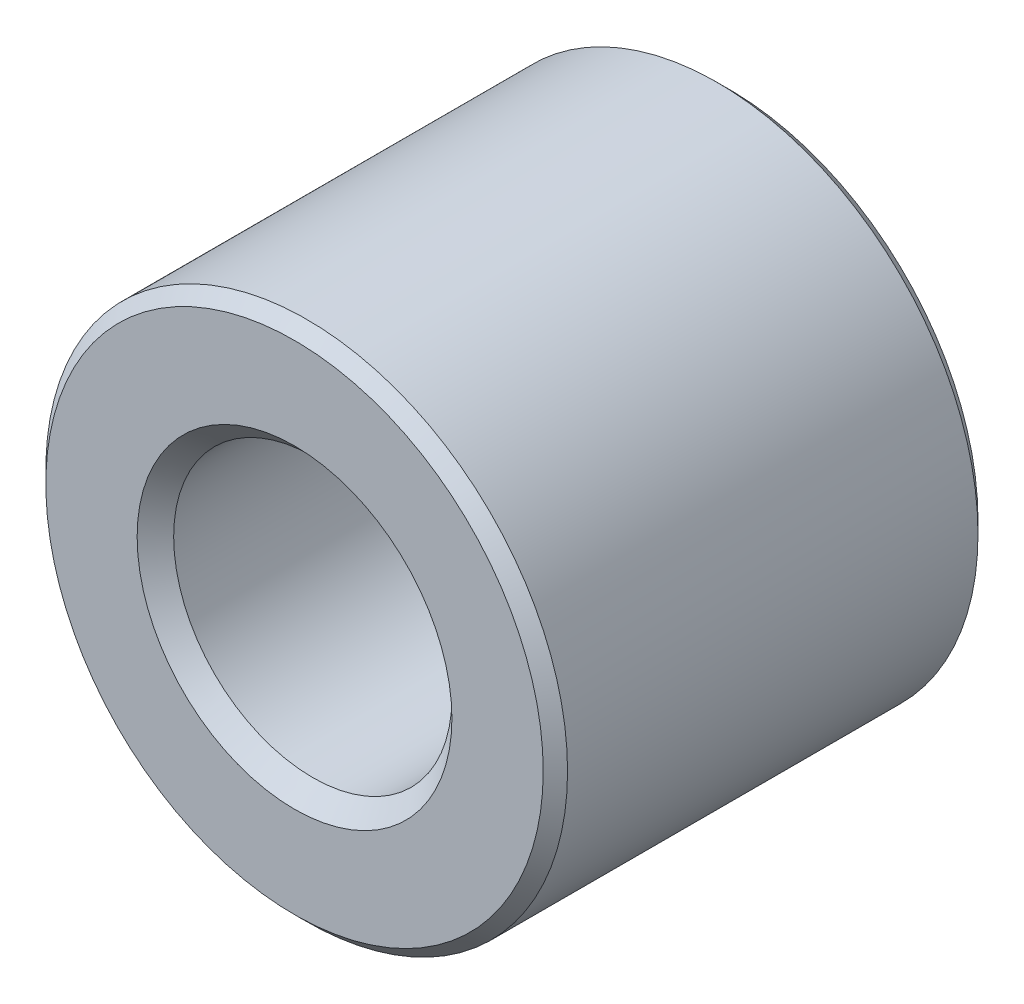
ISO-10303-21;
HEADER;
FILE_DESCRIPTION(('STEP AP214'),'2;1');
FILE_NAME('part.step','',(''),(''),'','','');
FILE_SCHEMA(('AUTOMOTIVE_DESIGN { 1 0 10303 214 1 1 1 1 }'));
ENDSEC;
DATA;
#1=APPLICATION_CONTEXT('core data for automotive mechanical design processes');
#2=APPLICATION_PROTOCOL_DEFINITION('international standard','automotive_design',2000,#1);
#3=PRODUCT_CONTEXT('',#1,'mechanical');
#4=PRODUCT('Part','Part','',(#3));
#5=PRODUCT_RELATED_PRODUCT_CATEGORY('part','',(#4));
#6=PRODUCT_DEFINITION_FORMATION('','',#4);
#7=PRODUCT_DEFINITION_CONTEXT('part definition',#1,'design');
#8=PRODUCT_DEFINITION('design','',#6,#7);
#9=PRODUCT_DEFINITION_SHAPE('','',#8);
#10=(LENGTH_UNIT() NAMED_UNIT(*) SI_UNIT(.MILLI.,.METRE.));
#11=(NAMED_UNIT(*) PLANE_ANGLE_UNIT() SI_UNIT($,.RADIAN.));
#12=(NAMED_UNIT(*) SI_UNIT($,.STERADIAN.) SOLID_ANGLE_UNIT());
#13=UNCERTAINTY_MEASURE_WITH_UNIT(LENGTH_MEASURE(1.E-05),#10,'distance_accuracy_value','');
#14=(GEOMETRIC_REPRESENTATION_CONTEXT(3) GLOBAL_UNCERTAINTY_ASSIGNED_CONTEXT((#13)) GLOBAL_UNIT_ASSIGNED_CONTEXT((#10,
#11,#12)) REPRESENTATION_CONTEXT('',''));
#15=CARTESIAN_POINT('',(0.,0.,0.));
#16=DIRECTION('',(0.,0.,1.));
#17=DIRECTION('',(1.,0.,0.));
#18=AXIS2_PLACEMENT_3D('',#15,#16,#17);
#19=CARTESIAN_POINT('',(0.,0.,-2.5));
#20=DIRECTION('',(0.,0.,1.));
#21=DIRECTION('',(1.,0.,0.));
#22=AXIS2_PLACEMENT_3D('',#19,#20,#21);
#23=CYLINDRICAL_SURFACE('',#22,3.);
#24=CARTESIAN_POINT('',(0.,0.,2.36));
#25=DIRECTION('',(0.,0.,1.));
#26=DIRECTION('',(1.,0.,0.));
#27=AXIS2_PLACEMENT_3D('',#24,#25,#26);
#28=CIRCLE('',#27,3.);
#29=CARTESIAN_POINT('',(3.,0.,2.36));
#30=VERTEX_POINT('',#29);
#31=EDGE_CURVE('E58',#30,#30,#28,.F.);
#32=ORIENTED_EDGE('',*,*,#31,.T.);
#33=EDGE_LOOP('',(#32));
#34=FACE_BOUND('',#33,.T.);
#35=CARTESIAN_POINT('',(0.,0.,-2.36));
#36=DIRECTION('',(0.,0.,1.));
#37=DIRECTION('',(1.,0.,0.));
#38=AXIS2_PLACEMENT_3D('',#35,#36,#37);
#39=CIRCLE('',#38,3.);
#40=CARTESIAN_POINT('',(3.,0.,-2.36));
#41=VERTEX_POINT('',#40);
#42=EDGE_CURVE('E61',#41,#41,#39,.T.);
#43=ORIENTED_EDGE('',*,*,#42,.T.);
#44=EDGE_LOOP('',(#43));
#45=FACE_BOUND('',#44,.T.);
#46=ADVANCED_FACE('F35',(#34,#45),#23,.T.);
#47=CARTESIAN_POINT('',(0.,0.,-2.5));
#48=DIRECTION('',(0.,0.,1.));
#49=DIRECTION('',(1.,0.,0.));
#50=AXIS2_PLACEMENT_3D('',#47,#48,#49);
#51=PLANE('',#50);
#52=CARTESIAN_POINT('',(0.,0.,-2.5));
#53=DIRECTION('',(0.,0.,1.));
#54=DIRECTION('',(1.,0.,0.));
#55=AXIS2_PLACEMENT_3D('',#52,#53,#54);
#56=CIRCLE('',#55,1.81);
#57=CARTESIAN_POINT('',(1.81,0.,-2.5));
#58=VERTEX_POINT('',#57);
#59=EDGE_CURVE('E10',#58,#58,#56,.T.);
#60=ORIENTED_EDGE('',*,*,#59,.T.);
#61=EDGE_LOOP('',(#60));
#62=FACE_BOUND('',#61,.T.);
#63=CARTESIAN_POINT('',(0.,0.,-2.5));
#64=DIRECTION('',(0.,0.,1.));
#65=DIRECTION('',(1.,0.,0.));
#66=AXIS2_PLACEMENT_3D('',#63,#64,#65);
#67=CIRCLE('',#66,2.86);
#68=CARTESIAN_POINT('',(2.86,0.,-2.5));
#69=VERTEX_POINT('',#68);
#70=EDGE_CURVE('E55',#69,#69,#67,.F.);
#71=ORIENTED_EDGE('',*,*,#70,.T.);
#72=EDGE_LOOP('',(#71));
#73=FACE_BOUND('',#72,.T.);
#74=ADVANCED_FACE('F87',(#62,#73),#51,.F.);
#75=CARTESIAN_POINT('',(0.,0.,-2.5));
#76=DIRECTION('',(0.,0.,1.));
#77=DIRECTION('',(1.,0.,0.));
#78=AXIS2_PLACEMENT_3D('',#75,#76,#77);
#79=CYLINDRICAL_SURFACE('',#78,1.6);
#80=CARTESIAN_POINT('',(0.,0.,2.29));
#81=DIRECTION('',(0.,0.,1.));
#82=DIRECTION('',(1.,0.,0.));
#83=AXIS2_PLACEMENT_3D('',#80,#81,#82);
#84=CIRCLE('',#83,1.6);
#85=CARTESIAN_POINT('',(1.6,0.,2.29));
#86=VERTEX_POINT('',#85);
#87=EDGE_CURVE('E46',#86,#86,#84,.T.);
#88=ORIENTED_EDGE('',*,*,#87,.T.);
#89=EDGE_LOOP('',(#88));
#90=FACE_BOUND('',#89,.T.);
#91=CARTESIAN_POINT('',(0.,0.,-2.29));
#92=DIRECTION('',(0.,0.,1.));
#93=DIRECTION('',(1.,0.,0.));
#94=AXIS2_PLACEMENT_3D('',#91,#92,#93);
#95=CIRCLE('',#94,1.6);
#96=CARTESIAN_POINT('',(1.6,0.,-2.29));
#97=VERTEX_POINT('',#96);
#98=EDGE_CURVE('E50',#97,#97,#95,.F.);
#99=ORIENTED_EDGE('',*,*,#98,.T.);
#100=EDGE_LOOP('',(#99));
#101=FACE_BOUND('',#100,.T.);
#102=ADVANCED_FACE('F82',(#90,#101),#79,.F.);
#103=CARTESIAN_POINT('',(0.,0.,2.5));
#104=DIRECTION('',(0.,0.,1.));
#105=DIRECTION('',(1.,0.,0.));
#106=AXIS2_PLACEMENT_3D('',#103,#104,#105);
#107=PLANE('',#106);
#108=CARTESIAN_POINT('',(0.,0.,2.5));
#109=DIRECTION('',(0.,0.,1.));
#110=DIRECTION('',(1.,0.,0.));
#111=AXIS2_PLACEMENT_3D('',#108,#109,#110);
#112=CIRCLE('',#111,1.81);
#113=CARTESIAN_POINT('',(1.81,0.,2.5));
#114=VERTEX_POINT('',#113);
#115=EDGE_CURVE('E42',#114,#114,#112,.F.);
#116=ORIENTED_EDGE('',*,*,#115,.T.);
#117=EDGE_LOOP('',(#116));
#118=FACE_BOUND('',#117,.T.);
#119=CARTESIAN_POINT('',(0.,0.,2.5));
#120=DIRECTION('',(0.,0.,1.));
#121=DIRECTION('',(1.,0.,0.));
#122=AXIS2_PLACEMENT_3D('',#119,#120,#121);
#123=CIRCLE('',#122,2.86);
#124=CARTESIAN_POINT('',(2.86,0.,2.5));
#125=VERTEX_POINT('',#124);
#126=EDGE_CURVE('E64',#125,#125,#123,.T.);
#127=ORIENTED_EDGE('',*,*,#126,.T.);
#128=EDGE_LOOP('',(#127));
#129=FACE_BOUND('',#128,.T.);
#130=ADVANCED_FACE('F68',(#118,#129),#107,.T.);
#131=CARTESIAN_POINT('',(0.,0.,2.5));
#132=DIRECTION('',(0.,0.,-1.));
#133=DIRECTION('',(-1.,0.,0.));
#134=AXIS2_PLACEMENT_3D('',#131,#132,#133);
#135=CONICAL_SURFACE('',#134,2.86,0.785398163397448);
#136=ORIENTED_EDGE('',*,*,#31,.F.);
#137=EDGE_LOOP('',(#136));
#138=FACE_BOUND('',#137,.T.);
#139=ORIENTED_EDGE('',*,*,#126,.F.);
#140=EDGE_LOOP('',(#139));
#141=FACE_BOUND('',#140,.T.);
#142=ADVANCED_FACE('F70',(#138,#141),#135,.T.);
#143=CARTESIAN_POINT('',(0.,0.,-2.36));
#144=DIRECTION('',(0.,0.,1.));
#145=DIRECTION('',(1.,0.,0.));
#146=AXIS2_PLACEMENT_3D('',#143,#144,#145);
#147=CONICAL_SURFACE('',#146,3.,0.785398163397448);
#148=ORIENTED_EDGE('',*,*,#70,.F.);
#149=EDGE_LOOP('',(#148));
#150=FACE_BOUND('',#149,.T.);
#151=ORIENTED_EDGE('',*,*,#42,.F.);
#152=EDGE_LOOP('',(#151));
#153=FACE_BOUND('',#152,.T.);
#154=ADVANCED_FACE('F72',(#150,#153),#147,.T.);
#155=CARTESIAN_POINT('',(0.,0.,2.29));
#156=DIRECTION('',(0.,0.,1.));
#157=DIRECTION('',(1.,0.,0.));
#158=AXIS2_PLACEMENT_3D('',#155,#156,#157);
#159=CONICAL_SURFACE('',#158,1.6,0.78539816339745);
#160=ORIENTED_EDGE('',*,*,#115,.F.);
#161=EDGE_LOOP('',(#160));
#162=FACE_BOUND('',#161,.T.);
#163=ORIENTED_EDGE('',*,*,#87,.F.);
#164=EDGE_LOOP('',(#163));
#165=FACE_BOUND('',#164,.T.);
#166=ADVANCED_FACE('F79',(#162,#165),#159,.F.);
#167=CARTESIAN_POINT('',(0.,0.,-2.5));
#168=DIRECTION('',(0.,0.,-1.));
#169=DIRECTION('',(-1.,0.,0.));
#170=AXIS2_PLACEMENT_3D('',#167,#168,#169);
#171=CONICAL_SURFACE('',#170,1.81,0.785398163397445);
#172=ORIENTED_EDGE('',*,*,#98,.F.);
#173=EDGE_LOOP('',(#172));
#174=FACE_BOUND('',#173,.T.);
#175=ORIENTED_EDGE('',*,*,#59,.F.);
#176=EDGE_LOOP('',(#175));
#177=FACE_BOUND('',#176,.T.);
#178=ADVANCED_FACE('F37',(#174,#177),#171,.F.);
#179=CLOSED_SHELL('',(#46,#74,#102,#130,#142,#154,#166,#178));
#180=MANIFOLD_SOLID_BREP('B2',#179);
#181=ADVANCED_BREP_SHAPE_REPRESENTATION('',(#18,#180),#14);
#182=SHAPE_DEFINITION_REPRESENTATION(#9,#181);
ENDSEC;
END-ISO-10303-21;
